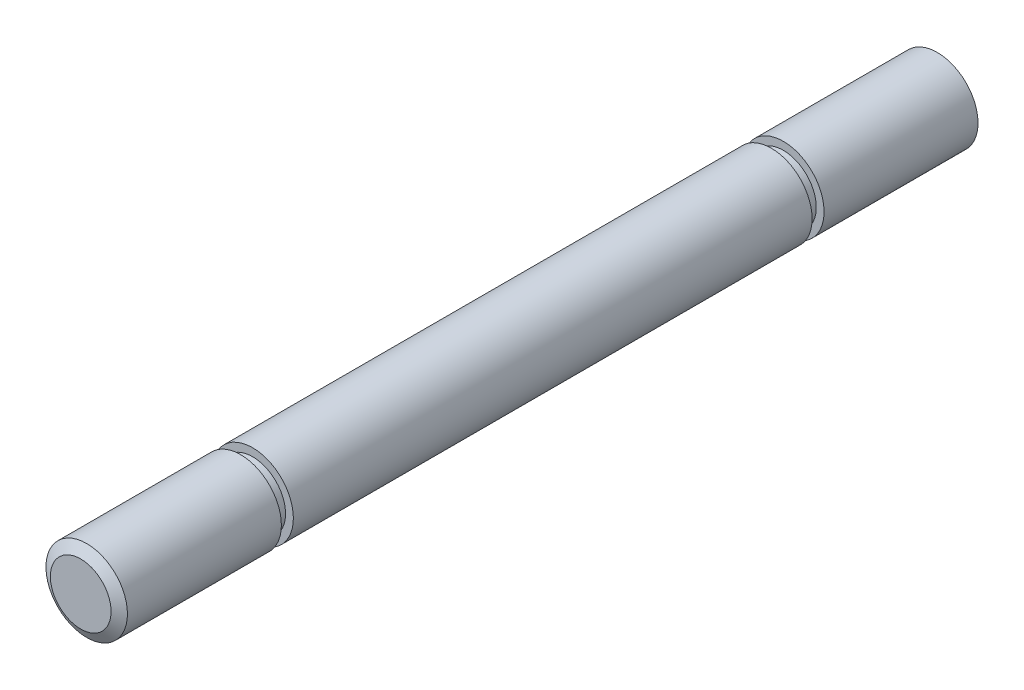
ISO-10303-21;
HEADER;
FILE_DESCRIPTION(('STEP AP214'),'2;1');
FILE_NAME('part.step','',(''),(''),'','','');
FILE_SCHEMA(('AUTOMOTIVE_DESIGN { 1 0 10303 214 1 1 1 1 }'));
ENDSEC;
DATA;
#1=APPLICATION_CONTEXT('core data for automotive mechanical design processes');
#2=APPLICATION_PROTOCOL_DEFINITION('international standard','automotive_design',2000,#1);
#3=PRODUCT_CONTEXT('',#1,'mechanical');
#4=PRODUCT('Part','Part','',(#3));
#5=PRODUCT_RELATED_PRODUCT_CATEGORY('part','',(#4));
#6=PRODUCT_DEFINITION_FORMATION('','',#4);
#7=PRODUCT_DEFINITION_CONTEXT('part definition',#1,'design');
#8=PRODUCT_DEFINITION('design','',#6,#7);
#9=PRODUCT_DEFINITION_SHAPE('','',#8);
#10=(LENGTH_UNIT() NAMED_UNIT(*) SI_UNIT(.MILLI.,.METRE.));
#11=(NAMED_UNIT(*) PLANE_ANGLE_UNIT() SI_UNIT($,.RADIAN.));
#12=(NAMED_UNIT(*) SI_UNIT($,.STERADIAN.) SOLID_ANGLE_UNIT());
#13=UNCERTAINTY_MEASURE_WITH_UNIT(LENGTH_MEASURE(1.E-05),#10,'distance_accuracy_value','');
#14=(GEOMETRIC_REPRESENTATION_CONTEXT(3) GLOBAL_UNCERTAINTY_ASSIGNED_CONTEXT((#13)) GLOBAL_UNIT_ASSIGNED_CONTEXT((#10,
#11,#12)) REPRESENTATION_CONTEXT('',''));
#15=CARTESIAN_POINT('',(0.,0.,0.));
#16=DIRECTION('',(0.,0.,1.));
#17=DIRECTION('',(1.,0.,0.));
#18=AXIS2_PLACEMENT_3D('',#15,#16,#17);
#19=CARTESIAN_POINT('',(0.,0.,36.));
#20=DIRECTION('',(0.,0.,1.));
#21=DIRECTION('',(0.,-1.,0.));
#22=AXIS2_PLACEMENT_3D('',#19,#20,#21);
#23=CYLINDRICAL_SURFACE('',#22,3.40000000000003);
#24=CARTESIAN_POINT('',(0.,0.,-21.65));
#25=DIRECTION('',(0.,0.,-1.));
#26=DIRECTION('',(-1.,0.,0.));
#27=AXIS2_PLACEMENT_3D('',#24,#25,#26);
#28=CIRCLE('',#27,3.40000000000003);
#29=CARTESIAN_POINT('',(-3.40000000000003,0.,-21.65));
#30=VERTEX_POINT('',#29);
#31=EDGE_CURVE('E67',#30,#30,#28,.T.);
#32=ORIENTED_EDGE('',*,*,#31,.F.);
#33=EDGE_LOOP('',(#32));
#34=FACE_BOUND('',#33,.T.);
#35=CARTESIAN_POINT('',(0.,0.,21.65));
#36=DIRECTION('',(0.,0.,1.));
#37=DIRECTION('',(1.,0.,0.));
#38=AXIS2_PLACEMENT_3D('',#35,#36,#37);
#39=CIRCLE('',#38,3.40000000000003);
#40=CARTESIAN_POINT('',(3.40000000000003,0.,21.65));
#41=VERTEX_POINT('',#40);
#42=EDGE_CURVE('E51',#41,#41,#39,.T.);
#43=ORIENTED_EDGE('',*,*,#42,.F.);
#44=EDGE_LOOP('',(#43));
#45=FACE_BOUND('',#44,.T.);
#46=ADVANCED_FACE('F47',(#34,#45),#23,.T.);
#47=CARTESIAN_POINT('',(-0.671408174689418,0.,-21.65));
#48=DIRECTION('',(0.,0.,-1.));
#49=DIRECTION('',(-1.,0.,0.));
#50=AXIS2_PLACEMENT_3D('',#47,#48,#49);
#51=PLANE('',#50);
#52=CARTESIAN_POINT('',(0.,0.,-21.65));
#53=DIRECTION('',(0.,0.,-1.));
#54=DIRECTION('',(-1.,0.,0.));
#55=AXIS2_PLACEMENT_3D('',#52,#53,#54);
#56=CIRCLE('',#55,2.75);
#57=CARTESIAN_POINT('',(-2.75,0.,-21.65));
#58=VERTEX_POINT('',#57);
#59=EDGE_CURVE('E68',#58,#58,#56,.T.);
#60=ORIENTED_EDGE('',*,*,#59,.F.);
#61=EDGE_LOOP('',(#60));
#62=FACE_BOUND('',#61,.T.);
#63=ORIENTED_EDGE('',*,*,#31,.T.);
#64=EDGE_LOOP('',(#63));
#65=FACE_BOUND('',#64,.T.);
#66=ADVANCED_FACE('F110',(#62,#65),#51,.T.);
#67=CARTESIAN_POINT('',(-0.671408174689418,0.,-22.65));
#68=DIRECTION('',(0.,0.,-1.));
#69=DIRECTION('',(-1.,0.,0.));
#70=AXIS2_PLACEMENT_3D('',#67,#68,#69);
#71=PLANE('',#70);
#72=CARTESIAN_POINT('',(0.,0.,-22.65));
#73=DIRECTION('',(0.,0.,-1.));
#74=DIRECTION('',(-1.,0.,0.));
#75=AXIS2_PLACEMENT_3D('',#72,#73,#74);
#76=CIRCLE('',#75,2.75);
#77=CARTESIAN_POINT('',(-2.75,0.,-22.65));
#78=VERTEX_POINT('',#77);
#79=EDGE_CURVE('E77',#78,#78,#76,.T.);
#80=ORIENTED_EDGE('',*,*,#79,.T.);
#81=EDGE_LOOP('',(#80));
#82=FACE_BOUND('',#81,.T.);
#83=CARTESIAN_POINT('',(0.,0.,-22.65));
#84=DIRECTION('',(0.,0.,-1.));
#85=DIRECTION('',(-1.,0.,0.));
#86=AXIS2_PLACEMENT_3D('',#83,#84,#85);
#87=CIRCLE('',#86,3.40000000000003);
#88=CARTESIAN_POINT('',(-3.40000000000003,0.,-22.65));
#89=VERTEX_POINT('',#88);
#90=EDGE_CURVE('E64',#89,#89,#87,.T.);
#91=ORIENTED_EDGE('',*,*,#90,.F.);
#92=EDGE_LOOP('',(#91));
#93=FACE_BOUND('',#92,.T.);
#94=ADVANCED_FACE('F115',(#82,#93),#71,.F.);
#95=CARTESIAN_POINT('',(0.,0.,-21.65));
#96=DIRECTION('',(0.,0.,-1.));
#97=DIRECTION('',(-1.,0.,0.));
#98=AXIS2_PLACEMENT_3D('',#95,#96,#97);
#99=CYLINDRICAL_SURFACE('',#98,2.75);
#100=ORIENTED_EDGE('',*,*,#59,.T.);
#101=EDGE_LOOP('',(#100));
#102=FACE_BOUND('',#101,.T.);
#103=ORIENTED_EDGE('',*,*,#79,.F.);
#104=EDGE_LOOP('',(#103));
#105=FACE_BOUND('',#104,.T.);
#106=ADVANCED_FACE('F107',(#102,#105),#99,.T.);
#107=CARTESIAN_POINT('',(0.,3.40000000000002,-36.));
#108=DIRECTION('',(0.,0.,1.));
#109=DIRECTION('',(0.,-1.,0.));
#110=AXIS2_PLACEMENT_3D('',#107,#108,#109);
#111=PLANE('',#110);
#112=CARTESIAN_POINT('',(0.,0.,-36.));
#113=DIRECTION('',(0.,0.,1.));
#114=DIRECTION('',(0.,-1.,0.));
#115=AXIS2_PLACEMENT_3D('',#112,#113,#114);
#116=CIRCLE('',#115,2.53397459621559);
#117=CARTESIAN_POINT('',(0.,-2.53397459621561,-36.));
#118=VERTEX_POINT('',#117);
#119=EDGE_CURVE('E13',#118,#118,#116,.F.);
#120=ORIENTED_EDGE('',*,*,#119,.T.);
#121=EDGE_LOOP('',(#120));
#122=FACE_BOUND('',#121,.T.);
#123=ADVANCED_FACE('F97',(#122),#111,.F.);
#124=CARTESIAN_POINT('',(0.,0.,-35.5));
#125=DIRECTION('',(0.,0.,1.));
#126=DIRECTION('',(0.,-1.,0.));
#127=AXIS2_PLACEMENT_3D('',#124,#125,#126);
#128=CONICAL_SURFACE('',#127,3.40000000000003,1.04719755119659);
#129=ORIENTED_EDGE('',*,*,#119,.F.);
#130=EDGE_LOOP('',(#129));
#131=FACE_BOUND('',#130,.T.);
#132=CARTESIAN_POINT('',(0.,0.,-35.5));
#133=DIRECTION('',(0.,0.,1.));
#134=DIRECTION('',(0.,-1.,0.));
#135=AXIS2_PLACEMENT_3D('',#132,#133,#134);
#136=CIRCLE('',#135,3.40000000000003);
#137=CARTESIAN_POINT('',(0.,-3.40000000000005,-35.5));
#138=VERTEX_POINT('',#137);
#139=EDGE_CURVE('E60',#138,#138,#136,.T.);
#140=ORIENTED_EDGE('',*,*,#139,.F.);
#141=EDGE_LOOP('',(#140));
#142=FACE_BOUND('',#141,.T.);
#143=ADVANCED_FACE('F49',(#131,#142),#128,.T.);
#144=ORIENTED_EDGE('',*,*,#90,.T.);
#145=EDGE_LOOP('',(#144));
#146=FACE_BOUND('',#145,.T.);
#147=ORIENTED_EDGE('',*,*,#139,.T.);
#148=EDGE_LOOP('',(#147));
#149=FACE_BOUND('',#148,.T.);
#150=ADVANCED_FACE('F94',(#146,#149),#23,.T.);
#151=CARTESIAN_POINT('',(-0.671408174689418,0.,21.65));
#152=DIRECTION('',(0.,0.,1.));
#153=DIRECTION('',(1.,0.,0.));
#154=AXIS2_PLACEMENT_3D('',#151,#152,#153);
#155=PLANE('',#154);
#156=CARTESIAN_POINT('',(0.,0.,21.65));
#157=DIRECTION('',(0.,0.,-1.));
#158=DIRECTION('',(-1.,0.,0.));
#159=AXIS2_PLACEMENT_3D('',#156,#157,#158);
#160=CIRCLE('',#159,2.75);
#161=CARTESIAN_POINT('',(-2.75,0.,21.65));
#162=VERTEX_POINT('',#161);
#163=EDGE_CURVE('E73',#162,#162,#160,.T.);
#164=ORIENTED_EDGE('',*,*,#163,.T.);
#165=EDGE_LOOP('',(#164));
#166=FACE_BOUND('',#165,.T.);
#167=ORIENTED_EDGE('',*,*,#42,.T.);
#168=EDGE_LOOP('',(#167));
#169=FACE_BOUND('',#168,.T.);
#170=ADVANCED_FACE('F103',(#166,#169),#155,.T.);
#171=CARTESIAN_POINT('',(-0.671408174689418,0.,22.65));
#172=DIRECTION('',(0.,0.,1.));
#173=DIRECTION('',(1.,0.,0.));
#174=AXIS2_PLACEMENT_3D('',#171,#172,#173);
#175=PLANE('',#174);
#176=CARTESIAN_POINT('',(0.,0.,22.65));
#177=DIRECTION('',(0.,0.,-1.));
#178=DIRECTION('',(-1.,0.,0.));
#179=AXIS2_PLACEMENT_3D('',#176,#177,#178);
#180=CIRCLE('',#179,2.75);
#181=CARTESIAN_POINT('',(-2.75,0.,22.65));
#182=VERTEX_POINT('',#181);
#183=EDGE_CURVE('E79',#182,#182,#180,.T.);
#184=ORIENTED_EDGE('',*,*,#183,.F.);
#185=EDGE_LOOP('',(#184));
#186=FACE_BOUND('',#185,.T.);
#187=CARTESIAN_POINT('',(0.,0.,22.65));
#188=DIRECTION('',(0.,0.,1.));
#189=DIRECTION('',(1.,0.,0.));
#190=AXIS2_PLACEMENT_3D('',#187,#188,#189);
#191=CIRCLE('',#190,3.40000000000003);
#192=CARTESIAN_POINT('',(3.40000000000003,0.,22.65));
#193=VERTEX_POINT('',#192);
#194=EDGE_CURVE('E71',#193,#193,#191,.T.);
#195=ORIENTED_EDGE('',*,*,#194,.F.);
#196=EDGE_LOOP('',(#195));
#197=FACE_BOUND('',#196,.T.);
#198=ADVANCED_FACE('F138',(#186,#197),#175,.F.);
#199=CARTESIAN_POINT('',(0.,0.,21.65));
#200=DIRECTION('',(0.,0.,1.));
#201=DIRECTION('',(1.,0.,0.));
#202=AXIS2_PLACEMENT_3D('',#199,#200,#201);
#203=CYLINDRICAL_SURFACE('',#202,2.75);
#204=ORIENTED_EDGE('',*,*,#163,.F.);
#205=EDGE_LOOP('',(#204));
#206=FACE_BOUND('',#205,.T.);
#207=ORIENTED_EDGE('',*,*,#183,.T.);
#208=EDGE_LOOP('',(#207));
#209=FACE_BOUND('',#208,.T.);
#210=ADVANCED_FACE('F134',(#206,#209),#203,.T.);
#211=CARTESIAN_POINT('',(0.,0.,36.));
#212=DIRECTION('',(0.,0.,-1.));
#213=DIRECTION('',(0.,1.,0.));
#214=AXIS2_PLACEMENT_3D('',#211,#212,#213);
#215=PLANE('',#214);
#216=CARTESIAN_POINT('',(0.,0.,36.));
#217=DIRECTION('',(0.,0.,-1.));
#218=DIRECTION('',(0.,1.,0.));
#219=AXIS2_PLACEMENT_3D('',#216,#217,#218);
#220=CIRCLE('',#219,2.53397459621559);
#221=CARTESIAN_POINT('',(0.,2.53397459621558,36.));
#222=VERTEX_POINT('',#221);
#223=EDGE_CURVE('E70',#222,#222,#220,.F.);
#224=ORIENTED_EDGE('',*,*,#223,.T.);
#225=EDGE_LOOP('',(#224));
#226=FACE_BOUND('',#225,.T.);
#227=ADVANCED_FACE('F126',(#226),#215,.F.);
#228=CARTESIAN_POINT('',(0.,0.,36.));
#229=DIRECTION('',(0.,0.,-1.));
#230=DIRECTION('',(0.,1.,0.));
#231=AXIS2_PLACEMENT_3D('',#228,#229,#230);
#232=CONICAL_SURFACE('',#231,2.53397459621559,1.04719755119659);
#233=CARTESIAN_POINT('',(0.,0.,35.5));
#234=DIRECTION('',(0.,0.,-1.));
#235=DIRECTION('',(0.,1.,0.));
#236=AXIS2_PLACEMENT_3D('',#233,#234,#235);
#237=CIRCLE('',#236,3.40000000000003);
#238=CARTESIAN_POINT('',(0.,3.40000000000003,35.5));
#239=VERTEX_POINT('',#238);
#240=EDGE_CURVE('E55',#239,#239,#237,.T.);
#241=ORIENTED_EDGE('',*,*,#240,.F.);
#242=EDGE_LOOP('',(#241));
#243=FACE_BOUND('',#242,.T.);
#244=ORIENTED_EDGE('',*,*,#223,.F.);
#245=EDGE_LOOP('',(#244));
#246=FACE_BOUND('',#245,.T.);
#247=ADVANCED_FACE('F122',(#243,#246),#232,.T.);
#248=ORIENTED_EDGE('',*,*,#194,.T.);
#249=EDGE_LOOP('',(#248));
#250=FACE_BOUND('',#249,.T.);
#251=ORIENTED_EDGE('',*,*,#240,.T.);
#252=EDGE_LOOP('',(#251));
#253=FACE_BOUND('',#252,.T.);
#254=ADVANCED_FACE('F106',(#250,#253),#23,.T.);
#255=CLOSED_SHELL('',(#46,#66,#94,#106,#123,#143,#150,#170,#198,#210,#227,#247,#254));
#256=MANIFOLD_SOLID_BREP('B2',#255);
#257=ADVANCED_BREP_SHAPE_REPRESENTATION('',(#18,#256),#14);
#258=SHAPE_DEFINITION_REPRESENTATION(#9,#257);
ENDSEC;
END-ISO-10303-21;
